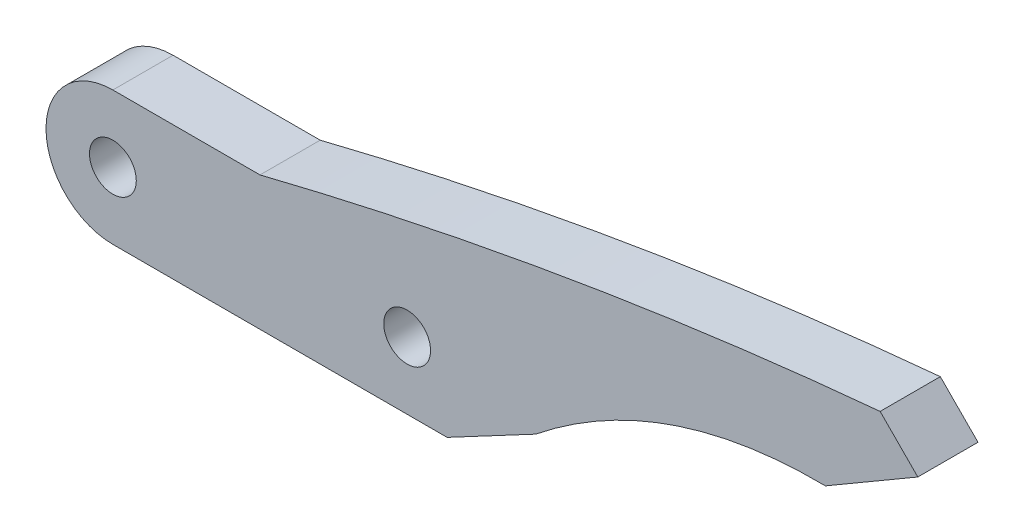
ISO-10303-21;
HEADER;
FILE_DESCRIPTION(('STEP AP214'),'2;1');
FILE_NAME('part.step','',(''),(''),'','','');
FILE_SCHEMA(('AUTOMOTIVE_DESIGN { 1 0 10303 214 1 1 1 1 }'));
ENDSEC;
DATA;
#1=APPLICATION_CONTEXT('core data for automotive mechanical design processes');
#2=APPLICATION_PROTOCOL_DEFINITION('international standard','automotive_design',2000,#1);
#3=PRODUCT_CONTEXT('',#1,'mechanical');
#4=PRODUCT('Part','Part','',(#3));
#5=PRODUCT_RELATED_PRODUCT_CATEGORY('part','',(#4));
#6=PRODUCT_DEFINITION_FORMATION('','',#4);
#7=PRODUCT_DEFINITION_CONTEXT('part definition',#1,'design');
#8=PRODUCT_DEFINITION('design','',#6,#7);
#9=PRODUCT_DEFINITION_SHAPE('','',#8);
#10=(LENGTH_UNIT() NAMED_UNIT(*) SI_UNIT(.MILLI.,.METRE.));
#11=(NAMED_UNIT(*) PLANE_ANGLE_UNIT() SI_UNIT($,.RADIAN.));
#12=(NAMED_UNIT(*) SI_UNIT($,.STERADIAN.) SOLID_ANGLE_UNIT());
#13=UNCERTAINTY_MEASURE_WITH_UNIT(LENGTH_MEASURE(1.E-05),#10,'distance_accuracy_value','');
#14=(GEOMETRIC_REPRESENTATION_CONTEXT(3) GLOBAL_UNCERTAINTY_ASSIGNED_CONTEXT((#13)) GLOBAL_UNIT_ASSIGNED_CONTEXT((#10,
#11,#12)) REPRESENTATION_CONTEXT('',''));
#15=CARTESIAN_POINT('',(0.,0.,0.));
#16=DIRECTION('',(0.,0.,1.));
#17=DIRECTION('',(1.,0.,0.));
#18=AXIS2_PLACEMENT_3D('',#15,#16,#17);
#19=CARTESIAN_POINT('',(-11.,0.,4.5));
#20=DIRECTION('',(0.,0.,-1.));
#21=DIRECTION('',(-1.,0.,0.));
#22=AXIS2_PLACEMENT_3D('',#19,#20,#21);
#23=CYLINDRICAL_SURFACE('',#22,5.);
#24=CARTESIAN_POINT('',(-11.,0.,0.));
#25=DIRECTION('',(0.,0.,1.));
#26=DIRECTION('',(1.,0.,0.));
#27=AXIS2_PLACEMENT_3D('',#24,#25,#26);
#28=CIRCLE('',#27,5.);
#29=CARTESIAN_POINT('',(-11.,5.,0.));
#30=VERTEX_POINT('',#29);
#31=CARTESIAN_POINT('',(-11.,-5.,0.));
#32=VERTEX_POINT('',#31);
#33=EDGE_CURVE('E74',#30,#32,#28,.T.);
#34=ORIENTED_EDGE('',*,*,#33,.T.);
#35=DIRECTION('',(0.,0.,-1.));
#36=VECTOR('',#35,1.);
#37=CARTESIAN_POINT('',(-11.,-5.,4.5));
#38=LINE('',#37,#36);
#39=CARTESIAN_POINT('',(-11.,-5.,4.5));
#40=VERTEX_POINT('',#39);
#41=EDGE_CURVE('E11',#40,#32,#38,.T.);
#42=ORIENTED_EDGE('',*,*,#41,.F.);
#43=CARTESIAN_POINT('',(-11.,0.,4.5));
#44=DIRECTION('',(0.,0.,1.));
#45=DIRECTION('',(1.,0.,0.));
#46=AXIS2_PLACEMENT_3D('',#43,#44,#45);
#47=CIRCLE('',#46,5.);
#48=CARTESIAN_POINT('',(-11.,5.,4.5));
#49=VERTEX_POINT('',#48);
#50=EDGE_CURVE('E77',#49,#40,#47,.T.);
#51=ORIENTED_EDGE('',*,*,#50,.F.);
#52=DIRECTION('',(0.,0.,-1.));
#53=VECTOR('',#52,1.);
#54=CARTESIAN_POINT('',(-11.,5.,4.5));
#55=LINE('',#54,#53);
#56=EDGE_CURVE('E47',#49,#30,#55,.T.);
#57=ORIENTED_EDGE('',*,*,#56,.T.);
#58=EDGE_LOOP('',(#34,#42,#51,#57));
#59=FACE_BOUND('',#58,.T.);
#60=ADVANCED_FACE('F41',(#59),#23,.T.);
#61=CARTESIAN_POINT('',(0.,-5.,4.5));
#62=DIRECTION('',(0.,1.,0.));
#63=DIRECTION('',(0.,0.,1.));
#64=AXIS2_PLACEMENT_3D('',#61,#62,#63);
#65=PLANE('',#64);
#66=DIRECTION('',(1.,0.,0.));
#67=VECTOR('',#66,1.);
#68=CARTESIAN_POINT('',(0.,-5.,0.));
#69=LINE('',#68,#67);
#70=CARTESIAN_POINT('',(13.99,-5.,0.));
#71=VERTEX_POINT('',#70);
#72=EDGE_CURVE('E88',#32,#71,#69,.T.);
#73=ORIENTED_EDGE('',*,*,#72,.T.);
#74=DIRECTION('',(0.,0.,1.));
#75=VECTOR('',#74,1.);
#76=CARTESIAN_POINT('',(13.99,-5.,-52.3267387246767));
#77=LINE('',#76,#75);
#78=CARTESIAN_POINT('',(13.99,-5.,4.5));
#79=VERTEX_POINT('',#78);
#80=EDGE_CURVE('E111',#71,#79,#77,.T.);
#81=ORIENTED_EDGE('',*,*,#80,.T.);
#82=DIRECTION('',(1.,0.,0.));
#83=VECTOR('',#82,1.);
#84=CARTESIAN_POINT('',(0.,-5.,4.5));
#85=LINE('',#84,#83);
#86=EDGE_CURVE('E108',#40,#79,#85,.T.);
#87=ORIENTED_EDGE('',*,*,#86,.F.);
#88=ORIENTED_EDGE('',*,*,#41,.T.);
#89=EDGE_LOOP('',(#73,#81,#87,#88));
#90=FACE_BOUND('',#89,.T.);
#91=ADVANCED_FACE('F191',(#90),#65,.F.);
#92=CARTESIAN_POINT('',(0.,5.,4.5));
#93=DIRECTION('',(0.,1.,0.));
#94=DIRECTION('',(0.,0.,1.));
#95=AXIS2_PLACEMENT_3D('',#92,#93,#94);
#96=PLANE('',#95);
#97=DIRECTION('',(0.,0.,1.));
#98=VECTOR('',#97,1.);
#99=CARTESIAN_POINT('',(0.,5.,-52.3267387246767));
#100=LINE('',#99,#98);
#101=CARTESIAN_POINT('',(0.,5.,0.));
#102=VERTEX_POINT('',#101);
#103=CARTESIAN_POINT('',(0.,5.,4.5));
#104=VERTEX_POINT('',#103);
#105=EDGE_CURVE('E57',#102,#104,#100,.T.);
#106=ORIENTED_EDGE('',*,*,#105,.F.);
#107=DIRECTION('',(1.,0.,0.));
#108=VECTOR('',#107,1.);
#109=CARTESIAN_POINT('',(0.,5.,0.));
#110=LINE('',#109,#108);
#111=EDGE_CURVE('E82',#30,#102,#110,.T.);
#112=ORIENTED_EDGE('',*,*,#111,.F.);
#113=ORIENTED_EDGE('',*,*,#56,.F.);
#114=DIRECTION('',(1.,0.,0.));
#115=VECTOR('',#114,1.);
#116=CARTESIAN_POINT('',(0.,5.,4.5));
#117=LINE('',#116,#115);
#118=EDGE_CURVE('E101',#49,#104,#117,.T.);
#119=ORIENTED_EDGE('',*,*,#118,.T.);
#120=EDGE_LOOP('',(#106,#112,#113,#119));
#121=FACE_BOUND('',#120,.T.);
#122=ADVANCED_FACE('F91',(#121),#96,.T.);
#123=CARTESIAN_POINT('',(-11.,0.,4.5));
#124=DIRECTION('',(0.,0.,-1.));
#125=DIRECTION('',(-1.,0.,0.));
#126=AXIS2_PLACEMENT_3D('',#123,#124,#125);
#127=CYLINDRICAL_SURFACE('',#126,1.75);
#128=CARTESIAN_POINT('',(-11.,0.,4.5));
#129=DIRECTION('',(0.,0.,1.));
#130=DIRECTION('',(1.,0.,0.));
#131=AXIS2_PLACEMENT_3D('',#128,#129,#130);
#132=CIRCLE('',#131,1.75);
#133=CARTESIAN_POINT('',(-9.25,0.,4.5));
#134=VERTEX_POINT('',#133);
#135=EDGE_CURVE('E94',#134,#134,#132,.T.);
#136=ORIENTED_EDGE('',*,*,#135,.T.);
#137=EDGE_LOOP('',(#136));
#138=FACE_BOUND('',#137,.T.);
#139=CARTESIAN_POINT('',(-11.,0.,0.));
#140=DIRECTION('',(0.,0.,1.));
#141=DIRECTION('',(1.,0.,0.));
#142=AXIS2_PLACEMENT_3D('',#139,#140,#141);
#143=CIRCLE('',#142,1.75);
#144=CARTESIAN_POINT('',(-9.25,0.,0.));
#145=VERTEX_POINT('',#144);
#146=EDGE_CURVE('E87',#145,#145,#143,.T.);
#147=ORIENTED_EDGE('',*,*,#146,.F.);
#148=EDGE_LOOP('',(#147));
#149=FACE_BOUND('',#148,.T.);
#150=ADVANCED_FACE('F43',(#138,#149),#127,.F.);
#151=CARTESIAN_POINT('',(11.,0.,4.5));
#152=DIRECTION('',(0.,0.,-1.));
#153=DIRECTION('',(-1.,0.,0.));
#154=AXIS2_PLACEMENT_3D('',#151,#152,#153);
#155=CYLINDRICAL_SURFACE('',#154,1.75);
#156=CARTESIAN_POINT('',(11.,0.,4.5));
#157=DIRECTION('',(0.,0.,1.));
#158=DIRECTION('',(1.,0.,0.));
#159=AXIS2_PLACEMENT_3D('',#156,#157,#158);
#160=CIRCLE('',#159,1.75);
#161=CARTESIAN_POINT('',(12.75,0.,4.5));
#162=VERTEX_POINT('',#161);
#163=EDGE_CURVE('E80',#162,#162,#160,.F.);
#164=ORIENTED_EDGE('',*,*,#163,.F.);
#165=EDGE_LOOP('',(#164));
#166=FACE_BOUND('',#165,.T.);
#167=CARTESIAN_POINT('',(11.,0.,0.));
#168=DIRECTION('',(0.,0.,1.));
#169=DIRECTION('',(1.,0.,0.));
#170=AXIS2_PLACEMENT_3D('',#167,#168,#169);
#171=CIRCLE('',#170,1.75);
#172=CARTESIAN_POINT('',(12.75,0.,0.));
#173=VERTEX_POINT('',#172);
#174=EDGE_CURVE('E95',#173,#173,#171,.F.);
#175=ORIENTED_EDGE('',*,*,#174,.T.);
#176=EDGE_LOOP('',(#175));
#177=FACE_BOUND('',#176,.T.);
#178=ADVANCED_FACE('F184',(#166,#177),#155,.F.);
#179=CARTESIAN_POINT('',(0.,0.,4.5));
#180=DIRECTION('',(0.,0.,1.));
#181=DIRECTION('',(1.,0.,0.));
#182=AXIS2_PLACEMENT_3D('',#179,#180,#181);
#183=PLANE('',#182);
#184=ORIENTED_EDGE('',*,*,#86,.T.);
#185=DIRECTION('',(0.882942972945771,0.469480251475697,0.));
#186=VECTOR('',#185,1.);
#187=CARTESIAN_POINT('',(20.61,-1.48,4.5));
#188=LINE('',#187,#186);
#189=CARTESIAN_POINT('',(20.61,-1.48,4.5));
#190=VERTEX_POINT('',#189);
#191=EDGE_CURVE('E139',#79,#190,#188,.T.);
#192=ORIENTED_EDGE('',*,*,#191,.T.);
#193=CARTESIAN_POINT('',(20.61,-1.48,4.5));
#194=CARTESIAN_POINT('',(30.1461507480521,6.15734830451268,4.5));
#195=CARTESIAN_POINT('',(42.27,6.,4.5));
#196=B_SPLINE_CURVE_WITH_KNOTS('',2,(#193,#194,#195),.UNSPECIFIED.,.F.,.F.,(3,3),(0.,1.),.UNSPECIFIED.);
#197=CARTESIAN_POINT('',(42.27,6.,4.5));
#198=VERTEX_POINT('',#197);
#199=EDGE_CURVE('E134',#190,#198,#196,.T.);
#200=ORIENTED_EDGE('',*,*,#199,.T.);
#201=DIRECTION('',(0.863849487758139,0.50375,0.));
#202=VECTOR('',#201,1.);
#203=CARTESIAN_POINT('',(49.1807959020651,10.03,4.5));
#204=LINE('',#203,#202);
#205=CARTESIAN_POINT('',(49.1807959020651,10.03,4.5));
#206=VERTEX_POINT('',#205);
#207=EDGE_CURVE('E135',#198,#206,#204,.T.);
#208=ORIENTED_EDGE('',*,*,#207,.T.);
#209=DIRECTION('',(-0.704201675658332,0.709999999999999,0.));
#210=VECTOR('',#209,1.);
#211=CARTESIAN_POINT('',(46.3639891994318,12.87,4.5));
#212=LINE('',#211,#210);
#213=CARTESIAN_POINT('',(46.3639891994318,12.87,4.5));
#214=VERTEX_POINT('',#213);
#215=EDGE_CURVE('E114',#206,#214,#212,.T.);
#216=ORIENTED_EDGE('',*,*,#215,.T.);
#217=CARTESIAN_POINT('',(46.3639891994318,12.87,4.5));
#218=CARTESIAN_POINT('',(22.8855175011126,10.7079266509718,4.5));
#219=CARTESIAN_POINT('',(0.,5.,4.5));
#220=B_SPLINE_CURVE_WITH_KNOTS('',2,(#217,#218,#219),.UNSPECIFIED.,.F.,.F.,(3,3),(0.,1.),.UNSPECIFIED.);
#221=EDGE_CURVE('E147',#214,#104,#220,.T.);
#222=ORIENTED_EDGE('',*,*,#221,.T.);
#223=ORIENTED_EDGE('',*,*,#118,.F.);
#224=ORIENTED_EDGE('',*,*,#50,.T.);
#225=EDGE_LOOP('',(#184,#192,#200,#208,#216,#222,#223,#224));
#226=FACE_BOUND('',#225,.T.);
#227=ORIENTED_EDGE('',*,*,#135,.F.);
#228=EDGE_LOOP('',(#227));
#229=FACE_BOUND('',#228,.T.);
#230=ORIENTED_EDGE('',*,*,#163,.T.);
#231=EDGE_LOOP('',(#230));
#232=FACE_BOUND('',#231,.T.);
#233=ADVANCED_FACE('F185',(#226,#229,#232),#183,.T.);
#234=CARTESIAN_POINT('',(0.,0.,0.));
#235=DIRECTION('',(0.,0.,1.));
#236=DIRECTION('',(1.,0.,0.));
#237=AXIS2_PLACEMENT_3D('',#234,#235,#236);
#238=PLANE('',#237);
#239=DIRECTION('',(-0.882942972945771,-0.469480251475697,0.));
#240=VECTOR('',#239,1.);
#241=CARTESIAN_POINT('',(20.61,-1.48,0.));
#242=LINE('',#241,#240);
#243=CARTESIAN_POINT('',(20.61,-1.48,0.));
#244=VERTEX_POINT('',#243);
#245=EDGE_CURVE('E129',#244,#71,#242,.T.);
#246=ORIENTED_EDGE('',*,*,#245,.T.);
#247=ORIENTED_EDGE('',*,*,#72,.F.);
#248=ORIENTED_EDGE('',*,*,#33,.F.);
#249=ORIENTED_EDGE('',*,*,#111,.T.);
#250=CARTESIAN_POINT('',(46.3639891994318,12.87,0.));
#251=CARTESIAN_POINT('',(22.8855175011126,10.7079266509718,0.));
#252=CARTESIAN_POINT('',(0.,5.,0.));
#253=B_SPLINE_CURVE_WITH_KNOTS('',2,(#250,#251,#252),.UNSPECIFIED.,.F.,.F.,(3,3),(0.,1.),.UNSPECIFIED.);
#254=CARTESIAN_POINT('',(46.3639891994318,12.87,0.));
#255=VERTEX_POINT('',#254);
#256=EDGE_CURVE('E102',#102,#255,#253,.F.);
#257=ORIENTED_EDGE('',*,*,#256,.T.);
#258=DIRECTION('',(0.704201675658332,-0.709999999999999,0.));
#259=VECTOR('',#258,1.);
#260=CARTESIAN_POINT('',(46.3639891994318,12.87,0.));
#261=LINE('',#260,#259);
#262=CARTESIAN_POINT('',(49.1807959020651,10.03,0.));
#263=VERTEX_POINT('',#262);
#264=EDGE_CURVE('E311',#255,#263,#261,.T.);
#265=ORIENTED_EDGE('',*,*,#264,.T.);
#266=DIRECTION('',(-0.863849487758139,-0.50375,0.));
#267=VECTOR('',#266,1.);
#268=CARTESIAN_POINT('',(49.1807959020651,10.03,0.));
#269=LINE('',#268,#267);
#270=CARTESIAN_POINT('',(42.27,6.,0.));
#271=VERTEX_POINT('',#270);
#272=EDGE_CURVE('E303',#263,#271,#269,.T.);
#273=ORIENTED_EDGE('',*,*,#272,.T.);
#274=CARTESIAN_POINT('',(20.61,-1.48,0.));
#275=CARTESIAN_POINT('',(30.1461507480521,6.15734830451268,0.));
#276=CARTESIAN_POINT('',(42.27,6.,0.));
#277=B_SPLINE_CURVE_WITH_KNOTS('',2,(#274,#275,#276),.UNSPECIFIED.,.F.,.F.,(3,3),(0.,1.),.UNSPECIFIED.);
#278=EDGE_CURVE('E315',#271,#244,#277,.F.);
#279=ORIENTED_EDGE('',*,*,#278,.T.);
#280=EDGE_LOOP('',(#246,#247,#248,#249,#257,#265,#273,#279));
#281=FACE_BOUND('',#280,.T.);
#282=ORIENTED_EDGE('',*,*,#146,.T.);
#283=EDGE_LOOP('',(#282));
#284=FACE_BOUND('',#283,.T.);
#285=ORIENTED_EDGE('',*,*,#174,.F.);
#286=EDGE_LOOP('',(#285));
#287=FACE_BOUND('',#286,.T.);
#288=ADVANCED_FACE('F85',(#281,#284,#287),#238,.F.);
#289=CARTESIAN_POINT('',(46.3639891994318,12.87,-52.3267387246767));
#290=CARTESIAN_POINT('',(22.8855175011126,10.7079266509718,-52.3267387246767));
#291=CARTESIAN_POINT('',(0.,5.,-52.3267387246767));
#292=B_SPLINE_CURVE_WITH_KNOTS('',2,(#289,#290,#291),.UNSPECIFIED.,.F.,.F.,(3,3),(0.,1.),.UNSPECIFIED.);
#293=DIRECTION('',(0.,0.,1.));
#294=VECTOR('',#293,1.);
#295=SURFACE_OF_LINEAR_EXTRUSION('',#292,#294);
#296=ORIENTED_EDGE('',*,*,#256,.F.);
#297=ORIENTED_EDGE('',*,*,#105,.T.);
#298=ORIENTED_EDGE('',*,*,#221,.F.);
#299=DIRECTION('',(0.,0.,1.));
#300=VECTOR('',#299,1.);
#301=CARTESIAN_POINT('',(46.3639891994318,12.87,-52.3267387246767));
#302=LINE('',#301,#300);
#303=EDGE_CURVE('E128',#255,#214,#302,.T.);
#304=ORIENTED_EDGE('',*,*,#303,.F.);
#305=EDGE_LOOP('',(#296,#297,#298,#304));
#306=FACE_BOUND('',#305,.T.);
#307=ADVANCED_FACE('F180',(#306),#295,.T.);
#308=CARTESIAN_POINT('',(46.3639891994318,12.87,-52.3267387246767));
#309=DIRECTION('',(0.709999999999998,0.704201675658332,0.));
#310=DIRECTION('',(-0.704201675658332,0.709999999999999,0.));
#311=AXIS2_PLACEMENT_3D('',#308,#309,#310);
#312=PLANE('',#311);
#313=ORIENTED_EDGE('',*,*,#264,.F.);
#314=ORIENTED_EDGE('',*,*,#303,.T.);
#315=ORIENTED_EDGE('',*,*,#215,.F.);
#316=DIRECTION('',(0.,0.,1.));
#317=VECTOR('',#316,1.);
#318=CARTESIAN_POINT('',(49.1807959020651,10.03,-52.3267387246767));
#319=LINE('',#318,#317);
#320=EDGE_CURVE('E121',#263,#206,#319,.T.);
#321=ORIENTED_EDGE('',*,*,#320,.F.);
#322=EDGE_LOOP('',(#313,#314,#315,#321));
#323=FACE_BOUND('',#322,.T.);
#324=ADVANCED_FACE('F179',(#323),#312,.T.);
#325=CARTESIAN_POINT('',(49.1807959020651,10.03,-52.3267387246767));
#326=DIRECTION('',(0.50375,-0.863849487758139,0.));
#327=DIRECTION('',(0.863849487758139,0.50375,0.));
#328=AXIS2_PLACEMENT_3D('',#325,#326,#327);
#329=PLANE('',#328);
#330=ORIENTED_EDGE('',*,*,#272,.F.);
#331=ORIENTED_EDGE('',*,*,#320,.T.);
#332=ORIENTED_EDGE('',*,*,#207,.F.);
#333=DIRECTION('',(0.,0.,1.));
#334=VECTOR('',#333,1.);
#335=CARTESIAN_POINT('',(42.27,6.,-52.3267387246767));
#336=LINE('',#335,#334);
#337=EDGE_CURVE('E119',#271,#198,#336,.T.);
#338=ORIENTED_EDGE('',*,*,#337,.F.);
#339=EDGE_LOOP('',(#330,#331,#332,#338));
#340=FACE_BOUND('',#339,.T.);
#341=ADVANCED_FACE('F173',(#340),#329,.T.);
#342=CARTESIAN_POINT('',(20.61,-1.48,-52.3267387246767));
#343=CARTESIAN_POINT('',(30.1461507480521,6.15734830451268,-52.3267387246767));
#344=CARTESIAN_POINT('',(42.27,6.,-52.3267387246767));
#345=B_SPLINE_CURVE_WITH_KNOTS('',2,(#342,#343,#344),.UNSPECIFIED.,.F.,.F.,(3,3),(0.,1.),.UNSPECIFIED.);
#346=DIRECTION('',(0.,0.,1.));
#347=VECTOR('',#346,1.);
#348=SURFACE_OF_LINEAR_EXTRUSION('',#345,#347);
#349=ORIENTED_EDGE('',*,*,#278,.F.);
#350=ORIENTED_EDGE('',*,*,#337,.T.);
#351=ORIENTED_EDGE('',*,*,#199,.F.);
#352=DIRECTION('',(0.,0.,1.));
#353=VECTOR('',#352,1.);
#354=CARTESIAN_POINT('',(20.61,-1.48,-52.3267387246767));
#355=LINE('',#354,#353);
#356=EDGE_CURVE('E120',#244,#190,#355,.T.);
#357=ORIENTED_EDGE('',*,*,#356,.F.);
#358=EDGE_LOOP('',(#349,#350,#351,#357));
#359=FACE_BOUND('',#358,.T.);
#360=ADVANCED_FACE('F168',(#359),#348,.T.);
#361=CARTESIAN_POINT('',(20.61,-1.48,-52.3267387246767));
#362=DIRECTION('',(0.469480251475697,-0.882942972945771,0.));
#363=DIRECTION('',(0.882942972945771,0.469480251475697,0.));
#364=AXIS2_PLACEMENT_3D('',#361,#362,#363);
#365=PLANE('',#364);
#366=ORIENTED_EDGE('',*,*,#245,.F.);
#367=ORIENTED_EDGE('',*,*,#356,.T.);
#368=ORIENTED_EDGE('',*,*,#191,.F.);
#369=ORIENTED_EDGE('',*,*,#80,.F.);
#370=EDGE_LOOP('',(#366,#367,#368,#369));
#371=FACE_BOUND('',#370,.T.);
#372=ADVANCED_FACE('F169',(#371),#365,.T.);
#373=CLOSED_SHELL('',(#60,#91,#122,#150,#178,#233,#288,#307,#324,#341,#360,#372));
#374=MANIFOLD_SOLID_BREP('B2',#373);
#375=ADVANCED_BREP_SHAPE_REPRESENTATION('',(#18,#374),#14);
#376=SHAPE_DEFINITION_REPRESENTATION(#9,#375);
ENDSEC;
END-ISO-10303-21;
